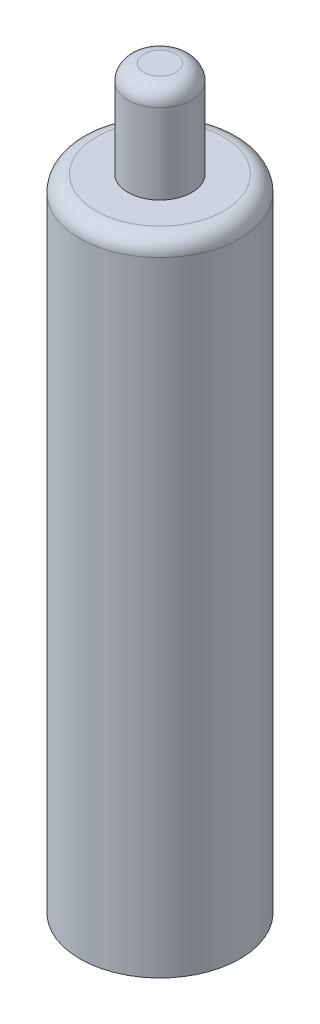
ISO-10303-21;
HEADER;
FILE_DESCRIPTION(('STEP AP214'),'2;1');
FILE_NAME('part.step','',(''),(''),'','','');
FILE_SCHEMA(('AUTOMOTIVE_DESIGN { 1 0 10303 214 1 1 1 1 }'));
ENDSEC;
DATA;
#1=APPLICATION_CONTEXT('core data for automotive mechanical design processes');
#2=APPLICATION_PROTOCOL_DEFINITION('international standard','automotive_design',2000,#1);
#3=PRODUCT_CONTEXT('',#1,'mechanical');
#4=PRODUCT('Part','Part','',(#3));
#5=PRODUCT_RELATED_PRODUCT_CATEGORY('part','',(#4));
#6=PRODUCT_DEFINITION_FORMATION('','',#4);
#7=PRODUCT_DEFINITION_CONTEXT('part definition',#1,'design');
#8=PRODUCT_DEFINITION('design','',#6,#7);
#9=PRODUCT_DEFINITION_SHAPE('','',#8);
#10=(LENGTH_UNIT() NAMED_UNIT(*) SI_UNIT(.MILLI.,.METRE.));
#11=(NAMED_UNIT(*) PLANE_ANGLE_UNIT() SI_UNIT($,.RADIAN.));
#12=(NAMED_UNIT(*) SI_UNIT($,.STERADIAN.) SOLID_ANGLE_UNIT());
#13=UNCERTAINTY_MEASURE_WITH_UNIT(LENGTH_MEASURE(1.E-05),#10,'distance_accuracy_value','');
#14=(GEOMETRIC_REPRESENTATION_CONTEXT(3) GLOBAL_UNCERTAINTY_ASSIGNED_CONTEXT((#13)) GLOBAL_UNIT_ASSIGNED_CONTEXT((#10,
#11,#12)) REPRESENTATION_CONTEXT('',''));
#15=CARTESIAN_POINT('',(0.,0.,0.));
#16=DIRECTION('',(0.,0.,1.));
#17=DIRECTION('',(1.,0.,0.));
#18=AXIS2_PLACEMENT_3D('',#15,#16,#17);
#19=CARTESIAN_POINT('',(0.,20.,0.));
#20=DIRECTION('',(0.,-1.,0.));
#21=DIRECTION('',(0.,0.,-1.));
#22=AXIS2_PLACEMENT_3D('',#19,#20,#21);
#23=CYLINDRICAL_SURFACE('',#22,2.5);
#24=CARTESIAN_POINT('',(0.,19.5,0.));
#25=DIRECTION('',(0.,1.,0.));
#26=DIRECTION('',(0.,0.,1.));
#27=AXIS2_PLACEMENT_3D('',#24,#25,#26);
#28=CIRCLE('',#27,2.5);
#29=CARTESIAN_POINT('',(0.,19.5,2.5));
#30=VERTEX_POINT('',#29);
#31=EDGE_CURVE('E54',#30,#30,#28,.F.);
#32=ORIENTED_EDGE('',*,*,#31,.T.);
#33=EDGE_LOOP('',(#32));
#34=FACE_BOUND('',#33,.T.);
#35=CARTESIAN_POINT('',(0.,0.,0.));
#36=DIRECTION('',(0.,1.,0.));
#37=DIRECTION('',(0.,0.,1.));
#38=AXIS2_PLACEMENT_3D('',#35,#36,#37);
#39=CIRCLE('',#38,2.5);
#40=CARTESIAN_POINT('',(0.,0.,2.5));
#41=VERTEX_POINT('',#40);
#42=EDGE_CURVE('E66',#41,#41,#39,.T.);
#43=ORIENTED_EDGE('',*,*,#42,.T.);
#44=EDGE_LOOP('',(#43));
#45=FACE_BOUND('',#44,.T.);
#46=ADVANCED_FACE('F41',(#34,#45),#23,.T.);
#47=CARTESIAN_POINT('',(0.,20.,0.));
#48=DIRECTION('',(0.,1.,0.));
#49=DIRECTION('',(0.,0.,1.));
#50=AXIS2_PLACEMENT_3D('',#47,#48,#49);
#51=PLANE('',#50);
#52=CARTESIAN_POINT('',(0.,20.,0.));
#53=DIRECTION('',(0.,1.,0.));
#54=DIRECTION('',(0.,0.,1.));
#55=AXIS2_PLACEMENT_3D('',#52,#53,#54);
#56=CIRCLE('',#55,2.);
#57=CARTESIAN_POINT('',(0.,20.,2.));
#58=VERTEX_POINT('',#57);
#59=EDGE_CURVE('E59',#58,#58,#56,.T.);
#60=ORIENTED_EDGE('',*,*,#59,.T.);
#61=EDGE_LOOP('',(#60));
#62=FACE_BOUND('',#61,.T.);
#63=CARTESIAN_POINT('',(0.,20.,0.));
#64=DIRECTION('',(0.,1.,0.));
#65=DIRECTION('',(0.,0.,1.));
#66=AXIS2_PLACEMENT_3D('',#63,#64,#65);
#67=CIRCLE('',#66,1.);
#68=CARTESIAN_POINT('',(0.,20.,1.));
#69=VERTEX_POINT('',#68);
#70=EDGE_CURVE('E65',#69,#69,#67,.T.);
#71=ORIENTED_EDGE('',*,*,#70,.F.);
#72=EDGE_LOOP('',(#71));
#73=FACE_BOUND('',#72,.T.);
#74=ADVANCED_FACE('F76',(#62,#73),#51,.T.);
#75=CARTESIAN_POINT('',(0.,0.,0.));
#76=DIRECTION('',(0.,1.,0.));
#77=DIRECTION('',(0.,0.,1.));
#78=AXIS2_PLACEMENT_3D('',#75,#76,#77);
#79=PLANE('',#78);
#80=ORIENTED_EDGE('',*,*,#42,.F.);
#81=EDGE_LOOP('',(#80));
#82=FACE_BOUND('',#81,.T.);
#83=ADVANCED_FACE('F78',(#82),#79,.F.);
#84=CARTESIAN_POINT('',(0.,23.,0.));
#85=DIRECTION('',(0.,-1.,0.));
#86=DIRECTION('',(0.,0.,-1.));
#87=AXIS2_PLACEMENT_3D('',#84,#85,#86);
#88=CYLINDRICAL_SURFACE('',#87,1.);
#89=CARTESIAN_POINT('',(0.,22.5,0.));
#90=DIRECTION('',(0.,1.,0.));
#91=DIRECTION('',(0.,0.,1.));
#92=AXIS2_PLACEMENT_3D('',#89,#90,#91);
#93=CIRCLE('',#92,1.);
#94=CARTESIAN_POINT('',(0.,22.5,1.));
#95=VERTEX_POINT('',#94);
#96=EDGE_CURVE('E10',#95,#95,#93,.F.);
#97=ORIENTED_EDGE('',*,*,#96,.T.);
#98=EDGE_LOOP('',(#97));
#99=FACE_BOUND('',#98,.T.);
#100=ORIENTED_EDGE('',*,*,#70,.T.);
#101=EDGE_LOOP('',(#100));
#102=FACE_BOUND('',#101,.T.);
#103=ADVANCED_FACE('F74',(#99,#102),#88,.T.);
#104=CARTESIAN_POINT('',(0.,23.,0.));
#105=DIRECTION('',(0.,1.,0.));
#106=DIRECTION('',(0.,0.,1.));
#107=AXIS2_PLACEMENT_3D('',#104,#105,#106);
#108=PLANE('',#107);
#109=CARTESIAN_POINT('',(0.,23.,0.));
#110=DIRECTION('',(0.,1.,0.));
#111=DIRECTION('',(0.,0.,1.));
#112=AXIS2_PLACEMENT_3D('',#109,#110,#111);
#113=CIRCLE('',#112,0.5);
#114=CARTESIAN_POINT('',(0.,23.,0.5));
#115=VERTEX_POINT('',#114);
#116=EDGE_CURVE('E49',#115,#115,#113,.T.);
#117=ORIENTED_EDGE('',*,*,#116,.T.);
#118=EDGE_LOOP('',(#117));
#119=FACE_BOUND('',#118,.T.);
#120=ADVANCED_FACE('F93',(#119),#108,.T.);
#121=CARTESIAN_POINT('',(0.,19.5,0.));
#122=DIRECTION('',(0.,1.,0.));
#123=DIRECTION('',(0.,0.,1.));
#124=AXIS2_PLACEMENT_3D('',#121,#122,#123);
#125=TOROIDAL_SURFACE('',#124,2.,0.5);
#126=ORIENTED_EDGE('',*,*,#31,.F.);
#127=EDGE_LOOP('',(#126));
#128=FACE_BOUND('',#127,.T.);
#129=ORIENTED_EDGE('',*,*,#59,.F.);
#130=EDGE_LOOP('',(#129));
#131=FACE_BOUND('',#130,.T.);
#132=ADVANCED_FACE('F91',(#128,#131),#125,.T.);
#133=CARTESIAN_POINT('',(0.,22.5,0.));
#134=DIRECTION('',(0.,1.,0.));
#135=DIRECTION('',(0.,0.,1.));
#136=AXIS2_PLACEMENT_3D('',#133,#134,#135);
#137=DEGENERATE_TOROIDAL_SURFACE('',#136,0.5,0.5,.T.);
#138=ORIENTED_EDGE('',*,*,#96,.F.);
#139=EDGE_LOOP('',(#138));
#140=FACE_BOUND('',#139,.T.);
#141=ORIENTED_EDGE('',*,*,#116,.F.);
#142=EDGE_LOOP('',(#141));
#143=FACE_BOUND('',#142,.T.);
#144=ADVANCED_FACE('F43',(#140,#143),#137,.T.);
#145=CLOSED_SHELL('',(#46,#74,#83,#103,#120,#132,#144));
#146=MANIFOLD_SOLID_BREP('B2',#145);
#147=ADVANCED_BREP_SHAPE_REPRESENTATION('',(#18,#146),#14);
#148=SHAPE_DEFINITION_REPRESENTATION(#9,#147);
ENDSEC;
END-ISO-10303-21;
